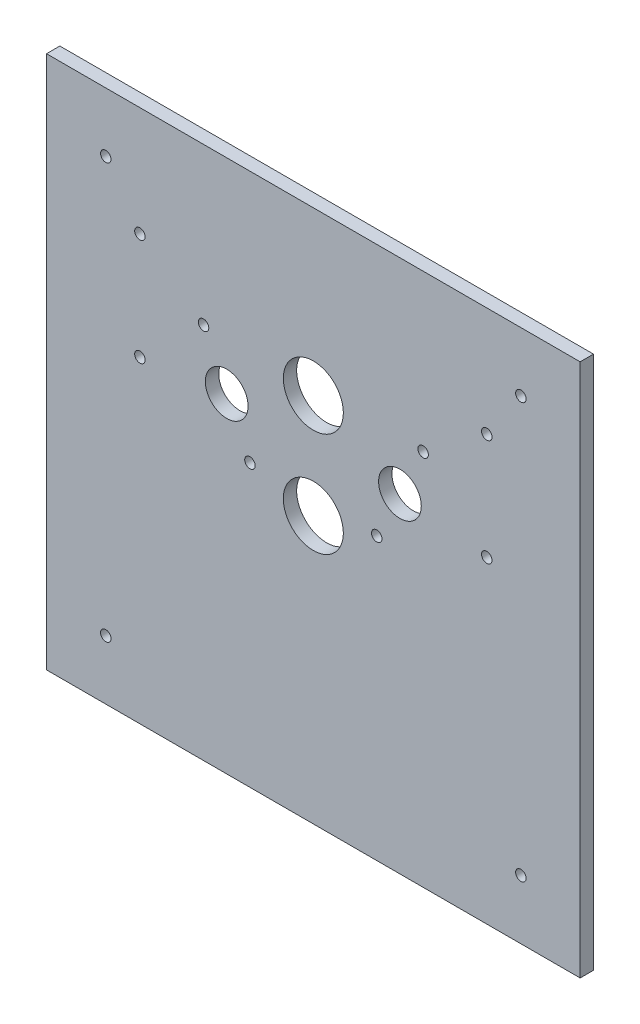
ISO-10303-21;
HEADER;
FILE_DESCRIPTION(('STEP AP214'),'2;1');
FILE_NAME('part.step','',(''),(''),'','','');
FILE_SCHEMA(('AUTOMOTIVE_DESIGN { 1 0 10303 214 1 1 1 1 }'));
ENDSEC;
DATA;
#1=APPLICATION_CONTEXT('core data for automotive mechanical design processes');
#2=APPLICATION_PROTOCOL_DEFINITION('international standard','automotive_design',2000,#1);
#3=PRODUCT_CONTEXT('',#1,'mechanical');
#4=PRODUCT('Part','Part','',(#3));
#5=PRODUCT_RELATED_PRODUCT_CATEGORY('part','',(#4));
#6=PRODUCT_DEFINITION_FORMATION('','',#4);
#7=PRODUCT_DEFINITION_CONTEXT('part definition',#1,'design');
#8=PRODUCT_DEFINITION('design','',#6,#7);
#9=PRODUCT_DEFINITION_SHAPE('','',#8);
#10=(LENGTH_UNIT() NAMED_UNIT(*) SI_UNIT(.MILLI.,.METRE.));
#11=(NAMED_UNIT(*) PLANE_ANGLE_UNIT() SI_UNIT($,.RADIAN.));
#12=(NAMED_UNIT(*) SI_UNIT($,.STERADIAN.) SOLID_ANGLE_UNIT());
#13=UNCERTAINTY_MEASURE_WITH_UNIT(LENGTH_MEASURE(1.E-05),#10,'distance_accuracy_value','');
#14=(GEOMETRIC_REPRESENTATION_CONTEXT(3) GLOBAL_UNCERTAINTY_ASSIGNED_CONTEXT((#13)) GLOBAL_UNIT_ASSIGNED_CONTEXT((#10,
#11,#12)) REPRESENTATION_CONTEXT('',''));
#15=CARTESIAN_POINT('',(0.,0.,0.));
#16=DIRECTION('',(0.,0.,1.));
#17=DIRECTION('',(1.,0.,0.));
#18=AXIS2_PLACEMENT_3D('',#15,#16,#17);
#19=CARTESIAN_POINT('',(0.,-127.,6.35));
#20=DIRECTION('',(0.,1.,0.));
#21=DIRECTION('',(-1.,0.,0.));
#22=AXIS2_PLACEMENT_3D('',#19,#20,#21);
#23=PLANE('',#22);
#24=DIRECTION('',(1.,0.,0.));
#25=VECTOR('',#24,1.);
#26=CARTESIAN_POINT('',(0.,-127.,0.));
#27=LINE('',#26,#25);
#28=CARTESIAN_POINT('',(-127.,-127.,0.));
#29=VERTEX_POINT('',#28);
#30=CARTESIAN_POINT('',(127.,-127.,0.));
#31=VERTEX_POINT('',#30);
#32=EDGE_CURVE('E115',#29,#31,#27,.T.);
#33=ORIENTED_EDGE('',*,*,#32,.T.);
#34=DIRECTION('',(0.,0.,-1.));
#35=VECTOR('',#34,1.);
#36=CARTESIAN_POINT('',(127.,-127.,6.35));
#37=LINE('',#36,#35);
#38=CARTESIAN_POINT('',(127.,-127.,6.35));
#39=VERTEX_POINT('',#38);
#40=EDGE_CURVE('E11',#39,#31,#37,.T.);
#41=ORIENTED_EDGE('',*,*,#40,.F.);
#42=DIRECTION('',(1.,0.,0.));
#43=VECTOR('',#42,1.);
#44=CARTESIAN_POINT('',(0.,-127.,6.35));
#45=LINE('',#44,#43);
#46=CARTESIAN_POINT('',(-127.,-127.,6.35));
#47=VERTEX_POINT('',#46);
#48=EDGE_CURVE('E89',#47,#39,#45,.T.);
#49=ORIENTED_EDGE('',*,*,#48,.F.);
#50=DIRECTION('',(0.,0.,-1.));
#51=VECTOR('',#50,1.);
#52=CARTESIAN_POINT('',(-127.,-127.,6.35));
#53=LINE('',#52,#51);
#54=EDGE_CURVE('E55',#47,#29,#53,.T.);
#55=ORIENTED_EDGE('',*,*,#54,.T.);
#56=EDGE_LOOP('',(#33,#41,#49,#55));
#57=FACE_BOUND('',#56,.T.);
#58=ADVANCED_FACE('F39',(#57),#23,.F.);
#59=CARTESIAN_POINT('',(127.,0.,6.35));
#60=DIRECTION('',(-1.,0.,0.));
#61=DIRECTION('',(0.,-1.,0.));
#62=AXIS2_PLACEMENT_3D('',#59,#60,#61);
#63=PLANE('',#62);
#64=DIRECTION('',(0.,1.,0.));
#65=VECTOR('',#64,1.);
#66=CARTESIAN_POINT('',(127.,0.,0.));
#67=LINE('',#66,#65);
#68=CARTESIAN_POINT('',(127.,127.,0.));
#69=VERTEX_POINT('',#68);
#70=EDGE_CURVE('E94',#31,#69,#67,.T.);
#71=ORIENTED_EDGE('',*,*,#70,.T.);
#72=DIRECTION('',(0.,0.,-1.));
#73=VECTOR('',#72,1.);
#74=CARTESIAN_POINT('',(127.,127.,6.35));
#75=LINE('',#74,#73);
#76=CARTESIAN_POINT('',(127.,127.,6.35));
#77=VERTEX_POINT('',#76);
#78=EDGE_CURVE('E47',#77,#69,#75,.T.);
#79=ORIENTED_EDGE('',*,*,#78,.F.);
#80=DIRECTION('',(0.,1.,0.));
#81=VECTOR('',#80,1.);
#82=CARTESIAN_POINT('',(127.,0.,6.35));
#83=LINE('',#82,#81);
#84=EDGE_CURVE('E80',#39,#77,#83,.T.);
#85=ORIENTED_EDGE('',*,*,#84,.F.);
#86=ORIENTED_EDGE('',*,*,#40,.T.);
#87=EDGE_LOOP('',(#71,#79,#85,#86));
#88=FACE_BOUND('',#87,.T.);
#89=ADVANCED_FACE('F93',(#88),#63,.F.);
#90=CARTESIAN_POINT('',(0.,127.,6.35));
#91=DIRECTION('',(0.,1.,0.));
#92=DIRECTION('',(0.,0.,1.));
#93=AXIS2_PLACEMENT_3D('',#90,#91,#92);
#94=PLANE('',#93);
#95=DIRECTION('',(1.,0.,0.));
#96=VECTOR('',#95,1.);
#97=CARTESIAN_POINT('',(0.,127.,0.));
#98=LINE('',#97,#96);
#99=CARTESIAN_POINT('',(-127.,127.,0.));
#100=VERTEX_POINT('',#99);
#101=EDGE_CURVE('E119',#100,#69,#98,.T.);
#102=ORIENTED_EDGE('',*,*,#101,.F.);
#103=DIRECTION('',(0.,0.,-1.));
#104=VECTOR('',#103,1.);
#105=CARTESIAN_POINT('',(-127.,127.,6.35));
#106=LINE('',#105,#104);
#107=CARTESIAN_POINT('',(-127.,127.,6.35));
#108=VERTEX_POINT('',#107);
#109=EDGE_CURVE('E69',#108,#100,#106,.T.);
#110=ORIENTED_EDGE('',*,*,#109,.F.);
#111=DIRECTION('',(1.,0.,0.));
#112=VECTOR('',#111,1.);
#113=CARTESIAN_POINT('',(0.,127.,6.35));
#114=LINE('',#113,#112);
#115=EDGE_CURVE('E88',#108,#77,#114,.T.);
#116=ORIENTED_EDGE('',*,*,#115,.T.);
#117=ORIENTED_EDGE('',*,*,#78,.T.);
#118=EDGE_LOOP('',(#102,#110,#116,#117));
#119=FACE_BOUND('',#118,.T.);
#120=ADVANCED_FACE('F97',(#119),#94,.T.);
#121=CARTESIAN_POINT('',(0.,0.,6.35));
#122=DIRECTION('',(0.,0.,-1.));
#123=DIRECTION('',(-1.,0.,0.));
#124=AXIS2_PLACEMENT_3D('',#121,#122,#123);
#125=CYLINDRICAL_SURFACE('',#124,14.2875);
#126=CARTESIAN_POINT('',(0.,0.,6.35));
#127=DIRECTION('',(0.,0.,1.));
#128=DIRECTION('',(1.,0.,0.));
#129=AXIS2_PLACEMENT_3D('',#126,#127,#128);
#130=CIRCLE('',#129,14.2875);
#131=CARTESIAN_POINT('',(14.2875,0.,6.35));
#132=VERTEX_POINT('',#131);
#133=EDGE_CURVE('E109',#132,#132,#130,.T.);
#134=ORIENTED_EDGE('',*,*,#133,.T.);
#135=EDGE_LOOP('',(#134));
#136=FACE_BOUND('',#135,.T.);
#137=CARTESIAN_POINT('',(0.,0.,0.));
#138=DIRECTION('',(0.,0.,1.));
#139=DIRECTION('',(1.,0.,0.));
#140=AXIS2_PLACEMENT_3D('',#137,#138,#139);
#141=CIRCLE('',#140,14.2875);
#142=CARTESIAN_POINT('',(14.2875,0.,0.));
#143=VERTEX_POINT('',#142);
#144=EDGE_CURVE('E130',#143,#143,#141,.T.);
#145=ORIENTED_EDGE('',*,*,#144,.F.);
#146=EDGE_LOOP('',(#145));
#147=FACE_BOUND('',#146,.T.);
#148=ADVANCED_FACE('F249',(#136,#147),#125,.F.);
#149=CARTESIAN_POINT('',(0.,49.5808,6.35));
#150=DIRECTION('',(0.,0.,-1.));
#151=DIRECTION('',(-1.,0.,0.));
#152=AXIS2_PLACEMENT_3D('',#149,#150,#151);
#153=CYLINDRICAL_SURFACE('',#152,14.2875);
#154=CARTESIAN_POINT('',(0.,49.5808,6.35));
#155=DIRECTION('',(0.,0.,1.));
#156=DIRECTION('',(1.,0.,0.));
#157=AXIS2_PLACEMENT_3D('',#154,#155,#156);
#158=CIRCLE('',#157,14.2875);
#159=CARTESIAN_POINT('',(14.2875,49.5808,6.35));
#160=VERTEX_POINT('',#159);
#161=EDGE_CURVE('E106',#160,#160,#158,.T.);
#162=ORIENTED_EDGE('',*,*,#161,.T.);
#163=EDGE_LOOP('',(#162));
#164=FACE_BOUND('',#163,.T.);
#165=CARTESIAN_POINT('',(0.,49.5808,0.));
#166=DIRECTION('',(0.,0.,1.));
#167=DIRECTION('',(1.,0.,0.));
#168=AXIS2_PLACEMENT_3D('',#165,#166,#167);
#169=CIRCLE('',#168,14.2875);
#170=CARTESIAN_POINT('',(14.2875,49.5808,0.));
#171=VERTEX_POINT('',#170);
#172=EDGE_CURVE('E127',#171,#171,#169,.T.);
#173=ORIENTED_EDGE('',*,*,#172,.F.);
#174=EDGE_LOOP('',(#173));
#175=FACE_BOUND('',#174,.T.);
#176=ADVANCED_FACE('F251',(#164,#175),#153,.F.);
#177=CARTESIAN_POINT('',(-41.2219683088319,29.6882018442623,6.35));
#178=DIRECTION('',(0.,0.,-1.));
#179=DIRECTION('',(-1.,0.,0.));
#180=AXIS2_PLACEMENT_3D('',#177,#178,#179);
#181=CYLINDRICAL_SURFACE('',#180,10.16);
#182=CARTESIAN_POINT('',(-41.2219683088319,29.6882018442623,6.35));
#183=DIRECTION('',(0.,0.,1.));
#184=DIRECTION('',(1.,0.,0.));
#185=AXIS2_PLACEMENT_3D('',#182,#183,#184);
#186=CIRCLE('',#185,10.16);
#187=CARTESIAN_POINT('',(-31.0619683088319,29.6882018442623,6.35));
#188=VERTEX_POINT('',#187);
#189=EDGE_CURVE('E100',#188,#188,#186,.T.);
#190=ORIENTED_EDGE('',*,*,#189,.T.);
#191=EDGE_LOOP('',(#190));
#192=FACE_BOUND('',#191,.T.);
#193=CARTESIAN_POINT('',(-41.2219683088319,29.6882018442623,0.));
#194=DIRECTION('',(0.,0.,1.));
#195=DIRECTION('',(1.,0.,0.));
#196=AXIS2_PLACEMENT_3D('',#193,#194,#195);
#197=CIRCLE('',#196,10.16);
#198=CARTESIAN_POINT('',(-31.0619683088319,29.6882018442623,0.));
#199=VERTEX_POINT('',#198);
#200=EDGE_CURVE('E124',#199,#199,#197,.T.);
#201=ORIENTED_EDGE('',*,*,#200,.F.);
#202=EDGE_LOOP('',(#201));
#203=FACE_BOUND('',#202,.T.);
#204=ADVANCED_FACE('F258',(#192,#203),#181,.F.);
#205=CARTESIAN_POINT('',(-127.,0.,6.35));
#206=DIRECTION('',(-1.,0.,0.));
#207=DIRECTION('',(0.,-1.,0.));
#208=AXIS2_PLACEMENT_3D('',#205,#206,#207);
#209=PLANE('',#208);
#210=DIRECTION('',(0.,1.,0.));
#211=VECTOR('',#210,1.);
#212=CARTESIAN_POINT('',(-127.,0.,0.));
#213=LINE('',#212,#211);
#214=EDGE_CURVE('E121',#29,#100,#213,.T.);
#215=ORIENTED_EDGE('',*,*,#214,.F.);
#216=ORIENTED_EDGE('',*,*,#54,.F.);
#217=DIRECTION('',(0.,1.,0.));
#218=VECTOR('',#217,1.);
#219=CARTESIAN_POINT('',(-127.,0.,6.35));
#220=LINE('',#219,#218);
#221=EDGE_CURVE('E98',#47,#108,#220,.T.);
#222=ORIENTED_EDGE('',*,*,#221,.T.);
#223=ORIENTED_EDGE('',*,*,#109,.T.);
#224=EDGE_LOOP('',(#215,#216,#222,#223));
#225=FACE_BOUND('',#224,.T.);
#226=ADVANCED_FACE('F267',(#225),#209,.T.);
#227=CARTESIAN_POINT('',(41.2219683088319,29.6882018442623,6.35));
#228=DIRECTION('',(0.,0.,-1.));
#229=DIRECTION('',(-1.,0.,0.));
#230=AXIS2_PLACEMENT_3D('',#227,#228,#229);
#231=CYLINDRICAL_SURFACE('',#230,10.16);
#232=CARTESIAN_POINT('',(41.2219683088319,29.6882018442623,6.35));
#233=DIRECTION('',(0.,0.,1.));
#234=DIRECTION('',(1.,0.,0.));
#235=AXIS2_PLACEMENT_3D('',#232,#233,#234);
#236=CIRCLE('',#235,10.16);
#237=CARTESIAN_POINT('',(51.3819683088319,29.6882018442623,6.35));
#238=VERTEX_POINT('',#237);
#239=EDGE_CURVE('E112',#238,#238,#236,.F.);
#240=ORIENTED_EDGE('',*,*,#239,.F.);
#241=EDGE_LOOP('',(#240));
#242=FACE_BOUND('',#241,.T.);
#243=CARTESIAN_POINT('',(41.2219683088319,29.6882018442623,0.));
#244=DIRECTION('',(0.,0.,1.));
#245=DIRECTION('',(1.,0.,0.));
#246=AXIS2_PLACEMENT_3D('',#243,#244,#245);
#247=CIRCLE('',#246,10.16);
#248=CARTESIAN_POINT('',(51.3819683088319,29.6882018442623,0.));
#249=VERTEX_POINT('',#248);
#250=EDGE_CURVE('E133',#249,#249,#247,.F.);
#251=ORIENTED_EDGE('',*,*,#250,.T.);
#252=EDGE_LOOP('',(#251));
#253=FACE_BOUND('',#252,.T.);
#254=ADVANCED_FACE('F269',(#242,#253),#231,.F.);
#255=CARTESIAN_POINT('',(0.,0.,6.35));
#256=DIRECTION('',(0.,0.,1.));
#257=DIRECTION('',(1.,0.,0.));
#258=AXIS2_PLACEMENT_3D('',#255,#256,#257);
#259=PLANE('',#258);
#260=CARTESIAN_POINT('',(98.7828173317608,98.7828173317606,6.35));
#261=DIRECTION('',(0.,0.,-1.));
#262=DIRECTION('',(-1.,0.,0.));
#263=AXIS2_PLACEMENT_3D('',#260,#261,#262);
#264=CIRCLE('',#263,2.4892);
#265=CARTESIAN_POINT('',(96.2936173317608,98.7828173317606,6.35));
#266=VERTEX_POINT('',#265);
#267=EDGE_CURVE('E205',#266,#266,#264,.T.);
#268=ORIENTED_EDGE('',*,*,#267,.T.);
#269=EDGE_LOOP('',(#268));
#270=FACE_BOUND('',#269,.T.);
#271=CARTESIAN_POINT('',(52.2611459757229,52.5638779312944,6.35));
#272=DIRECTION('',(0.,0.,-1.));
#273=DIRECTION('',(-1.,0.,0.));
#274=AXIS2_PLACEMENT_3D('',#271,#272,#273);
#275=CIRCLE('',#274,2.4892);
#276=CARTESIAN_POINT('',(49.7719459757229,52.5638779312944,6.35));
#277=VERTEX_POINT('',#276);
#278=EDGE_CURVE('E199',#277,#277,#275,.T.);
#279=ORIENTED_EDGE('',*,*,#278,.T.);
#280=EDGE_LOOP('',(#279));
#281=FACE_BOUND('',#280,.T.);
#282=CARTESIAN_POINT('',(30.1827906419408,6.81252575723016,6.35));
#283=DIRECTION('',(0.,0.,-1.));
#284=DIRECTION('',(-1.,0.,0.));
#285=AXIS2_PLACEMENT_3D('',#282,#283,#284);
#286=CIRCLE('',#285,2.4892);
#287=CARTESIAN_POINT('',(27.6935906419408,6.81252575723016,6.35));
#288=VERTEX_POINT('',#287);
#289=EDGE_CURVE('E193',#288,#288,#286,.T.);
#290=ORIENTED_EDGE('',*,*,#289,.T.);
#291=EDGE_LOOP('',(#290));
#292=FACE_BOUND('',#291,.T.);
#293=CARTESIAN_POINT('',(-30.1827906419408,6.81252575723015,6.35));
#294=DIRECTION('',(0.,0.,-1.));
#295=DIRECTION('',(-1.,0.,0.));
#296=AXIS2_PLACEMENT_3D('',#293,#294,#295);
#297=CIRCLE('',#296,2.4892);
#298=CARTESIAN_POINT('',(-32.6719906419408,6.81252575723015,6.35));
#299=VERTEX_POINT('',#298);
#300=EDGE_CURVE('E187',#299,#299,#297,.T.);
#301=ORIENTED_EDGE('',*,*,#300,.T.);
#302=EDGE_LOOP('',(#301));
#303=FACE_BOUND('',#302,.T.);
#304=CARTESIAN_POINT('',(-52.261145975723,52.5638779312944,6.35));
#305=DIRECTION('',(0.,0.,-1.));
#306=DIRECTION('',(-1.,0.,0.));
#307=AXIS2_PLACEMENT_3D('',#304,#305,#306);
#308=CIRCLE('',#307,2.4892);
#309=CARTESIAN_POINT('',(-54.750345975723,52.5638779312944,6.35));
#310=VERTEX_POINT('',#309);
#311=EDGE_CURVE('E181',#310,#310,#308,.T.);
#312=ORIENTED_EDGE('',*,*,#311,.T.);
#313=EDGE_LOOP('',(#312));
#314=FACE_BOUND('',#313,.T.);
#315=CARTESIAN_POINT('',(-98.7828173317607,98.7828173317607,6.35));
#316=DIRECTION('',(0.,0.,-1.));
#317=DIRECTION('',(-1.,0.,0.));
#318=AXIS2_PLACEMENT_3D('',#315,#316,#317);
#319=CIRCLE('',#318,2.4892);
#320=CARTESIAN_POINT('',(-101.272017331761,98.7828173317607,6.35));
#321=VERTEX_POINT('',#320);
#322=EDGE_CURVE('E175',#321,#321,#319,.T.);
#323=ORIENTED_EDGE('',*,*,#322,.T.);
#324=EDGE_LOOP('',(#323));
#325=FACE_BOUND('',#324,.T.);
#326=CARTESIAN_POINT('',(-98.7828173317607,-98.7828173317607,6.35));
#327=DIRECTION('',(0.,0.,-1.));
#328=DIRECTION('',(-1.,0.,0.));
#329=AXIS2_PLACEMENT_3D('',#326,#327,#328);
#330=CIRCLE('',#329,2.4892);
#331=CARTESIAN_POINT('',(-101.272017331761,-98.7828173317607,6.35));
#332=VERTEX_POINT('',#331);
#333=EDGE_CURVE('E169',#332,#332,#330,.T.);
#334=ORIENTED_EDGE('',*,*,#333,.T.);
#335=EDGE_LOOP('',(#334));
#336=FACE_BOUND('',#335,.T.);
#337=CARTESIAN_POINT('',(98.7828173317607,-98.7828173317607,6.35));
#338=DIRECTION('',(0.,0.,-1.));
#339=DIRECTION('',(-1.,0.,0.));
#340=AXIS2_PLACEMENT_3D('',#337,#338,#339);
#341=CIRCLE('',#340,2.4892);
#342=CARTESIAN_POINT('',(96.2936173317607,-98.7828173317607,6.35));
#343=VERTEX_POINT('',#342);
#344=EDGE_CURVE('E163',#343,#343,#341,.T.);
#345=ORIENTED_EDGE('',*,*,#344,.T.);
#346=EDGE_LOOP('',(#345));
#347=FACE_BOUND('',#346,.T.);
#348=CARTESIAN_POINT('',(82.55,74.9808,6.35));
#349=DIRECTION('',(0.,0.,-1.));
#350=DIRECTION('',(-1.,0.,0.));
#351=AXIS2_PLACEMENT_3D('',#348,#349,#350);
#352=CIRCLE('',#351,2.4892);
#353=CARTESIAN_POINT('',(80.0608,74.9808,6.35));
#354=VERTEX_POINT('',#353);
#355=EDGE_CURVE('E157',#354,#354,#352,.T.);
#356=ORIENTED_EDGE('',*,*,#355,.T.);
#357=EDGE_LOOP('',(#356));
#358=FACE_BOUND('',#357,.T.);
#359=CARTESIAN_POINT('',(82.55,24.1808,6.35));
#360=DIRECTION('',(0.,0.,-1.));
#361=DIRECTION('',(-1.,0.,0.));
#362=AXIS2_PLACEMENT_3D('',#359,#360,#361);
#363=CIRCLE('',#362,2.4892);
#364=CARTESIAN_POINT('',(80.0608,24.1808,6.35));
#365=VERTEX_POINT('',#364);
#366=EDGE_CURVE('E151',#365,#365,#363,.T.);
#367=ORIENTED_EDGE('',*,*,#366,.T.);
#368=EDGE_LOOP('',(#367));
#369=FACE_BOUND('',#368,.T.);
#370=CARTESIAN_POINT('',(-82.55,74.9808,6.35));
#371=DIRECTION('',(0.,0.,-1.));
#372=DIRECTION('',(-1.,0.,0.));
#373=AXIS2_PLACEMENT_3D('',#370,#371,#372);
#374=CIRCLE('',#373,2.4892);
#375=CARTESIAN_POINT('',(-85.0392,74.9808,6.35));
#376=VERTEX_POINT('',#375);
#377=EDGE_CURVE('E145',#376,#376,#374,.T.);
#378=ORIENTED_EDGE('',*,*,#377,.T.);
#379=EDGE_LOOP('',(#378));
#380=FACE_BOUND('',#379,.T.);
#381=CARTESIAN_POINT('',(-82.55,24.1808,6.35));
#382=DIRECTION('',(0.,0.,-1.));
#383=DIRECTION('',(-1.,0.,0.));
#384=AXIS2_PLACEMENT_3D('',#381,#382,#383);
#385=CIRCLE('',#384,2.4892);
#386=CARTESIAN_POINT('',(-85.0392,24.1808,6.35));
#387=VERTEX_POINT('',#386);
#388=EDGE_CURVE('E117',#387,#387,#385,.T.);
#389=ORIENTED_EDGE('',*,*,#388,.T.);
#390=EDGE_LOOP('',(#389));
#391=FACE_BOUND('',#390,.T.);
#392=ORIENTED_EDGE('',*,*,#48,.T.);
#393=ORIENTED_EDGE('',*,*,#84,.T.);
#394=ORIENTED_EDGE('',*,*,#115,.F.);
#395=ORIENTED_EDGE('',*,*,#221,.F.);
#396=EDGE_LOOP('',(#392,#393,#394,#395));
#397=FACE_BOUND('',#396,.T.);
#398=ORIENTED_EDGE('',*,*,#189,.F.);
#399=EDGE_LOOP('',(#398));
#400=FACE_BOUND('',#399,.T.);
#401=ORIENTED_EDGE('',*,*,#161,.F.);
#402=EDGE_LOOP('',(#401));
#403=FACE_BOUND('',#402,.T.);
#404=ORIENTED_EDGE('',*,*,#133,.F.);
#405=EDGE_LOOP('',(#404));
#406=FACE_BOUND('',#405,.T.);
#407=ORIENTED_EDGE('',*,*,#239,.T.);
#408=EDGE_LOOP('',(#407));
#409=FACE_BOUND('',#408,.T.);
#410=ADVANCED_FACE('F84',(#270,#281,#292,#303,#314,#325,#336,#347,#358,#369,#380,#391,#397,#400,
#403,#406,#409),#259,.T.);
#411=CARTESIAN_POINT('',(0.,0.,0.));
#412=DIRECTION('',(0.,0.,1.));
#413=DIRECTION('',(1.,0.,0.));
#414=AXIS2_PLACEMENT_3D('',#411,#412,#413);
#415=PLANE('',#414);
#416=CARTESIAN_POINT('',(98.7828173317608,98.7828173317606,0.));
#417=DIRECTION('',(0.,0.,-1.));
#418=DIRECTION('',(-1.,0.,0.));
#419=AXIS2_PLACEMENT_3D('',#416,#417,#418);
#420=CIRCLE('',#419,2.4892);
#421=CARTESIAN_POINT('',(96.2936173317608,98.7828173317606,0.));
#422=VERTEX_POINT('',#421);
#423=EDGE_CURVE('E208',#422,#422,#420,.T.);
#424=ORIENTED_EDGE('',*,*,#423,.F.);
#425=EDGE_LOOP('',(#424));
#426=FACE_BOUND('',#425,.T.);
#427=CARTESIAN_POINT('',(52.2611459757229,52.5638779312944,0.));
#428=DIRECTION('',(0.,0.,-1.));
#429=DIRECTION('',(-1.,0.,0.));
#430=AXIS2_PLACEMENT_3D('',#427,#428,#429);
#431=CIRCLE('',#430,2.4892);
#432=CARTESIAN_POINT('',(49.7719459757229,52.5638779312944,0.));
#433=VERTEX_POINT('',#432);
#434=EDGE_CURVE('E202',#433,#433,#431,.T.);
#435=ORIENTED_EDGE('',*,*,#434,.F.);
#436=EDGE_LOOP('',(#435));
#437=FACE_BOUND('',#436,.T.);
#438=CARTESIAN_POINT('',(30.1827906419408,6.81252575723016,0.));
#439=DIRECTION('',(0.,0.,-1.));
#440=DIRECTION('',(-1.,0.,0.));
#441=AXIS2_PLACEMENT_3D('',#438,#439,#440);
#442=CIRCLE('',#441,2.4892);
#443=CARTESIAN_POINT('',(27.6935906419408,6.81252575723016,0.));
#444=VERTEX_POINT('',#443);
#445=EDGE_CURVE('E196',#444,#444,#442,.T.);
#446=ORIENTED_EDGE('',*,*,#445,.F.);
#447=EDGE_LOOP('',(#446));
#448=FACE_BOUND('',#447,.T.);
#449=CARTESIAN_POINT('',(-30.1827906419408,6.81252575723015,0.));
#450=DIRECTION('',(0.,0.,-1.));
#451=DIRECTION('',(-1.,0.,0.));
#452=AXIS2_PLACEMENT_3D('',#449,#450,#451);
#453=CIRCLE('',#452,2.4892);
#454=CARTESIAN_POINT('',(-32.6719906419408,6.81252575723015,0.));
#455=VERTEX_POINT('',#454);
#456=EDGE_CURVE('E190',#455,#455,#453,.T.);
#457=ORIENTED_EDGE('',*,*,#456,.F.);
#458=EDGE_LOOP('',(#457));
#459=FACE_BOUND('',#458,.T.);
#460=CARTESIAN_POINT('',(-52.261145975723,52.5638779312944,0.));
#461=DIRECTION('',(0.,0.,-1.));
#462=DIRECTION('',(-1.,0.,0.));
#463=AXIS2_PLACEMENT_3D('',#460,#461,#462);
#464=CIRCLE('',#463,2.4892);
#465=CARTESIAN_POINT('',(-54.750345975723,52.5638779312944,0.));
#466=VERTEX_POINT('',#465);
#467=EDGE_CURVE('E184',#466,#466,#464,.T.);
#468=ORIENTED_EDGE('',*,*,#467,.F.);
#469=EDGE_LOOP('',(#468));
#470=FACE_BOUND('',#469,.T.);
#471=CARTESIAN_POINT('',(-98.7828173317607,98.7828173317607,0.));
#472=DIRECTION('',(0.,0.,-1.));
#473=DIRECTION('',(-1.,0.,0.));
#474=AXIS2_PLACEMENT_3D('',#471,#472,#473);
#475=CIRCLE('',#474,2.4892);
#476=CARTESIAN_POINT('',(-101.272017331761,98.7828173317607,0.));
#477=VERTEX_POINT('',#476);
#478=EDGE_CURVE('E178',#477,#477,#475,.T.);
#479=ORIENTED_EDGE('',*,*,#478,.F.);
#480=EDGE_LOOP('',(#479));
#481=FACE_BOUND('',#480,.T.);
#482=CARTESIAN_POINT('',(-98.7828173317607,-98.7828173317607,0.));
#483=DIRECTION('',(0.,0.,-1.));
#484=DIRECTION('',(-1.,0.,0.));
#485=AXIS2_PLACEMENT_3D('',#482,#483,#484);
#486=CIRCLE('',#485,2.4892);
#487=CARTESIAN_POINT('',(-101.272017331761,-98.7828173317607,0.));
#488=VERTEX_POINT('',#487);
#489=EDGE_CURVE('E172',#488,#488,#486,.T.);
#490=ORIENTED_EDGE('',*,*,#489,.F.);
#491=EDGE_LOOP('',(#490));
#492=FACE_BOUND('',#491,.T.);
#493=CARTESIAN_POINT('',(98.7828173317607,-98.7828173317607,0.));
#494=DIRECTION('',(0.,0.,-1.));
#495=DIRECTION('',(-1.,0.,0.));
#496=AXIS2_PLACEMENT_3D('',#493,#494,#495);
#497=CIRCLE('',#496,2.4892);
#498=CARTESIAN_POINT('',(96.2936173317607,-98.7828173317607,0.));
#499=VERTEX_POINT('',#498);
#500=EDGE_CURVE('E166',#499,#499,#497,.T.);
#501=ORIENTED_EDGE('',*,*,#500,.F.);
#502=EDGE_LOOP('',(#501));
#503=FACE_BOUND('',#502,.T.);
#504=CARTESIAN_POINT('',(82.55,74.9808,0.));
#505=DIRECTION('',(0.,0.,-1.));
#506=DIRECTION('',(-1.,0.,0.));
#507=AXIS2_PLACEMENT_3D('',#504,#505,#506);
#508=CIRCLE('',#507,2.4892);
#509=CARTESIAN_POINT('',(80.0608,74.9808,0.));
#510=VERTEX_POINT('',#509);
#511=EDGE_CURVE('E160',#510,#510,#508,.T.);
#512=ORIENTED_EDGE('',*,*,#511,.F.);
#513=EDGE_LOOP('',(#512));
#514=FACE_BOUND('',#513,.T.);
#515=CARTESIAN_POINT('',(82.55,24.1808,0.));
#516=DIRECTION('',(0.,0.,-1.));
#517=DIRECTION('',(-1.,0.,0.));
#518=AXIS2_PLACEMENT_3D('',#515,#516,#517);
#519=CIRCLE('',#518,2.4892);
#520=CARTESIAN_POINT('',(80.0608,24.1808,0.));
#521=VERTEX_POINT('',#520);
#522=EDGE_CURVE('E154',#521,#521,#519,.T.);
#523=ORIENTED_EDGE('',*,*,#522,.F.);
#524=EDGE_LOOP('',(#523));
#525=FACE_BOUND('',#524,.T.);
#526=CARTESIAN_POINT('',(-82.55,74.9808,0.));
#527=DIRECTION('',(0.,0.,-1.));
#528=DIRECTION('',(-1.,0.,0.));
#529=AXIS2_PLACEMENT_3D('',#526,#527,#528);
#530=CIRCLE('',#529,2.4892);
#531=CARTESIAN_POINT('',(-85.0392,74.9808,0.));
#532=VERTEX_POINT('',#531);
#533=EDGE_CURVE('E148',#532,#532,#530,.T.);
#534=ORIENTED_EDGE('',*,*,#533,.F.);
#535=EDGE_LOOP('',(#534));
#536=FACE_BOUND('',#535,.T.);
#537=CARTESIAN_POINT('',(-82.55,24.1808,0.));
#538=DIRECTION('',(0.,0.,-1.));
#539=DIRECTION('',(-1.,0.,0.));
#540=AXIS2_PLACEMENT_3D('',#537,#538,#539);
#541=CIRCLE('',#540,2.4892);
#542=CARTESIAN_POINT('',(-85.0392,24.1808,0.));
#543=VERTEX_POINT('',#542);
#544=EDGE_CURVE('E142',#543,#543,#541,.T.);
#545=ORIENTED_EDGE('',*,*,#544,.F.);
#546=EDGE_LOOP('',(#545));
#547=FACE_BOUND('',#546,.T.);
#548=ORIENTED_EDGE('',*,*,#32,.F.);
#549=ORIENTED_EDGE('',*,*,#214,.T.);
#550=ORIENTED_EDGE('',*,*,#101,.T.);
#551=ORIENTED_EDGE('',*,*,#70,.F.);
#552=EDGE_LOOP('',(#548,#549,#550,#551));
#553=FACE_BOUND('',#552,.T.);
#554=ORIENTED_EDGE('',*,*,#200,.T.);
#555=EDGE_LOOP('',(#554));
#556=FACE_BOUND('',#555,.T.);
#557=ORIENTED_EDGE('',*,*,#172,.T.);
#558=EDGE_LOOP('',(#557));
#559=FACE_BOUND('',#558,.T.);
#560=ORIENTED_EDGE('',*,*,#144,.T.);
#561=EDGE_LOOP('',(#560));
#562=FACE_BOUND('',#561,.T.);
#563=ORIENTED_EDGE('',*,*,#250,.F.);
#564=EDGE_LOOP('',(#563));
#565=FACE_BOUND('',#564,.T.);
#566=ADVANCED_FACE('F214',(#426,#437,#448,#459,#470,#481,#492,#503,#514,#525,#536,#547,#553,
#556,#559,#562,#565),#415,.F.);
#567=CARTESIAN_POINT('',(-82.55,24.1808,0.));
#568=DIRECTION('',(0.,0.,-1.));
#569=DIRECTION('',(-1.,0.,0.));
#570=AXIS2_PLACEMENT_3D('',#567,#568,#569);
#571=CYLINDRICAL_SURFACE('',#570,2.4892);
#572=ORIENTED_EDGE('',*,*,#388,.F.);
#573=EDGE_LOOP('',(#572));
#574=FACE_BOUND('',#573,.T.);
#575=ORIENTED_EDGE('',*,*,#544,.T.);
#576=EDGE_LOOP('',(#575));
#577=FACE_BOUND('',#576,.T.);
#578=ADVANCED_FACE('F217',(#574,#577),#571,.F.);
#579=CARTESIAN_POINT('',(-82.55,74.9808,0.));
#580=DIRECTION('',(0.,0.,-1.));
#581=DIRECTION('',(-1.,0.,0.));
#582=AXIS2_PLACEMENT_3D('',#579,#580,#581);
#583=CYLINDRICAL_SURFACE('',#582,2.4892);
#584=ORIENTED_EDGE('',*,*,#377,.F.);
#585=EDGE_LOOP('',(#584));
#586=FACE_BOUND('',#585,.T.);
#587=ORIENTED_EDGE('',*,*,#533,.T.);
#588=EDGE_LOOP('',(#587));
#589=FACE_BOUND('',#588,.T.);
#590=ADVANCED_FACE('F298',(#586,#589),#583,.F.);
#591=CARTESIAN_POINT('',(82.55,24.1808,0.));
#592=DIRECTION('',(0.,0.,-1.));
#593=DIRECTION('',(-1.,0.,0.));
#594=AXIS2_PLACEMENT_3D('',#591,#592,#593);
#595=CYLINDRICAL_SURFACE('',#594,2.4892);
#596=ORIENTED_EDGE('',*,*,#366,.F.);
#597=EDGE_LOOP('',(#596));
#598=FACE_BOUND('',#597,.T.);
#599=ORIENTED_EDGE('',*,*,#522,.T.);
#600=EDGE_LOOP('',(#599));
#601=FACE_BOUND('',#600,.T.);
#602=ADVANCED_FACE('F302',(#598,#601),#595,.F.);
#603=CARTESIAN_POINT('',(82.55,74.9808,0.));
#604=DIRECTION('',(0.,0.,-1.));
#605=DIRECTION('',(-1.,0.,0.));
#606=AXIS2_PLACEMENT_3D('',#603,#604,#605);
#607=CYLINDRICAL_SURFACE('',#606,2.4892);
#608=ORIENTED_EDGE('',*,*,#355,.F.);
#609=EDGE_LOOP('',(#608));
#610=FACE_BOUND('',#609,.T.);
#611=ORIENTED_EDGE('',*,*,#511,.T.);
#612=EDGE_LOOP('',(#611));
#613=FACE_BOUND('',#612,.T.);
#614=ADVANCED_FACE('F306',(#610,#613),#607,.F.);
#615=CARTESIAN_POINT('',(98.7828173317607,-98.7828173317607,0.));
#616=DIRECTION('',(0.,0.,-1.));
#617=DIRECTION('',(-1.,0.,0.));
#618=AXIS2_PLACEMENT_3D('',#615,#616,#617);
#619=CYLINDRICAL_SURFACE('',#618,2.4892);
#620=ORIENTED_EDGE('',*,*,#344,.F.);
#621=EDGE_LOOP('',(#620));
#622=FACE_BOUND('',#621,.T.);
#623=ORIENTED_EDGE('',*,*,#500,.T.);
#624=EDGE_LOOP('',(#623));
#625=FACE_BOUND('',#624,.T.);
#626=ADVANCED_FACE('F310',(#622,#625),#619,.F.);
#627=CARTESIAN_POINT('',(-98.7828173317607,-98.7828173317607,0.));
#628=DIRECTION('',(0.,0.,-1.));
#629=DIRECTION('',(-1.,0.,0.));
#630=AXIS2_PLACEMENT_3D('',#627,#628,#629);
#631=CYLINDRICAL_SURFACE('',#630,2.4892);
#632=ORIENTED_EDGE('',*,*,#333,.F.);
#633=EDGE_LOOP('',(#632));
#634=FACE_BOUND('',#633,.T.);
#635=ORIENTED_EDGE('',*,*,#489,.T.);
#636=EDGE_LOOP('',(#635));
#637=FACE_BOUND('',#636,.T.);
#638=ADVANCED_FACE('F314',(#634,#637),#631,.F.);
#639=CARTESIAN_POINT('',(-98.7828173317607,98.7828173317607,0.));
#640=DIRECTION('',(0.,0.,-1.));
#641=DIRECTION('',(-1.,0.,0.));
#642=AXIS2_PLACEMENT_3D('',#639,#640,#641);
#643=CYLINDRICAL_SURFACE('',#642,2.4892);
#644=ORIENTED_EDGE('',*,*,#322,.F.);
#645=EDGE_LOOP('',(#644));
#646=FACE_BOUND('',#645,.T.);
#647=ORIENTED_EDGE('',*,*,#478,.T.);
#648=EDGE_LOOP('',(#647));
#649=FACE_BOUND('',#648,.T.);
#650=ADVANCED_FACE('F318',(#646,#649),#643,.F.);
#651=CARTESIAN_POINT('',(-52.261145975723,52.5638779312944,0.));
#652=DIRECTION('',(0.,0.,-1.));
#653=DIRECTION('',(-1.,0.,0.));
#654=AXIS2_PLACEMENT_3D('',#651,#652,#653);
#655=CYLINDRICAL_SURFACE('',#654,2.4892);
#656=ORIENTED_EDGE('',*,*,#311,.F.);
#657=EDGE_LOOP('',(#656));
#658=FACE_BOUND('',#657,.T.);
#659=ORIENTED_EDGE('',*,*,#467,.T.);
#660=EDGE_LOOP('',(#659));
#661=FACE_BOUND('',#660,.T.);
#662=ADVANCED_FACE('F322',(#658,#661),#655,.F.);
#663=CARTESIAN_POINT('',(-30.1827906419408,6.81252575723015,0.));
#664=DIRECTION('',(0.,0.,-1.));
#665=DIRECTION('',(-1.,0.,0.));
#666=AXIS2_PLACEMENT_3D('',#663,#664,#665);
#667=CYLINDRICAL_SURFACE('',#666,2.4892);
#668=ORIENTED_EDGE('',*,*,#300,.F.);
#669=EDGE_LOOP('',(#668));
#670=FACE_BOUND('',#669,.T.);
#671=ORIENTED_EDGE('',*,*,#456,.T.);
#672=EDGE_LOOP('',(#671));
#673=FACE_BOUND('',#672,.T.);
#674=ADVANCED_FACE('F326',(#670,#673),#667,.F.);
#675=CARTESIAN_POINT('',(30.1827906419408,6.81252575723016,0.));
#676=DIRECTION('',(0.,0.,-1.));
#677=DIRECTION('',(-1.,0.,0.));
#678=AXIS2_PLACEMENT_3D('',#675,#676,#677);
#679=CYLINDRICAL_SURFACE('',#678,2.4892);
#680=ORIENTED_EDGE('',*,*,#289,.F.);
#681=EDGE_LOOP('',(#680));
#682=FACE_BOUND('',#681,.T.);
#683=ORIENTED_EDGE('',*,*,#445,.T.);
#684=EDGE_LOOP('',(#683));
#685=FACE_BOUND('',#684,.T.);
#686=ADVANCED_FACE('F330',(#682,#685),#679,.F.);
#687=CARTESIAN_POINT('',(52.2611459757229,52.5638779312944,0.));
#688=DIRECTION('',(0.,0.,-1.));
#689=DIRECTION('',(-1.,0.,0.));
#690=AXIS2_PLACEMENT_3D('',#687,#688,#689);
#691=CYLINDRICAL_SURFACE('',#690,2.4892);
#692=ORIENTED_EDGE('',*,*,#278,.F.);
#693=EDGE_LOOP('',(#692));
#694=FACE_BOUND('',#693,.T.);
#695=ORIENTED_EDGE('',*,*,#434,.T.);
#696=EDGE_LOOP('',(#695));
#697=FACE_BOUND('',#696,.T.);
#698=ADVANCED_FACE('F334',(#694,#697),#691,.F.);
#699=CARTESIAN_POINT('',(98.7828173317608,98.7828173317606,0.));
#700=DIRECTION('',(0.,0.,-1.));
#701=DIRECTION('',(-1.,0.,0.));
#702=AXIS2_PLACEMENT_3D('',#699,#700,#701);
#703=CYLINDRICAL_SURFACE('',#702,2.4892);
#704=ORIENTED_EDGE('',*,*,#267,.F.);
#705=EDGE_LOOP('',(#704));
#706=FACE_BOUND('',#705,.T.);
#707=ORIENTED_EDGE('',*,*,#423,.T.);
#708=EDGE_LOOP('',(#707));
#709=FACE_BOUND('',#708,.T.);
#710=ADVANCED_FACE('F212',(#706,#709),#703,.F.);
#711=CLOSED_SHELL('',(#58,#89,#120,#148,#176,#204,#226,#254,#410,#566,#578,#590,#602,#614,#626,
#638,#650,#662,#674,#686,#698,#710));
#712=MANIFOLD_SOLID_BREP('B2',#711);
#713=ADVANCED_BREP_SHAPE_REPRESENTATION('',(#18,#712),#14);
#714=SHAPE_DEFINITION_REPRESENTATION(#9,#713);
ENDSEC;
END-ISO-10303-21;
